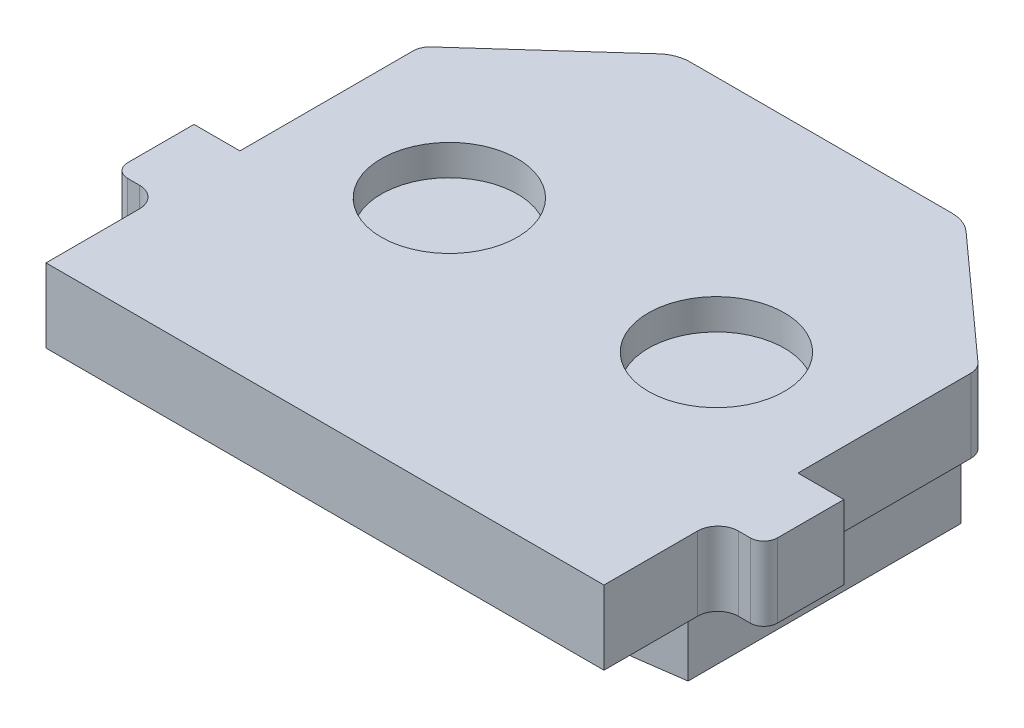
ISO-10303-21;
HEADER;
FILE_DESCRIPTION(('STEP AP214'),'2;1');
FILE_NAME('part.step','',(''),(''),'','','');
FILE_SCHEMA(('AUTOMOTIVE_DESIGN { 1 0 10303 214 1 1 1 1 }'));
ENDSEC;
DATA;
#1=APPLICATION_CONTEXT('core data for automotive mechanical design processes');
#2=APPLICATION_PROTOCOL_DEFINITION('international standard','automotive_design',2000,#1);
#3=PRODUCT_CONTEXT('',#1,'mechanical');
#4=PRODUCT('Part','Part','',(#3));
#5=PRODUCT_RELATED_PRODUCT_CATEGORY('part','',(#4));
#6=PRODUCT_DEFINITION_FORMATION('','',#4);
#7=PRODUCT_DEFINITION_CONTEXT('part definition',#1,'design');
#8=PRODUCT_DEFINITION('design','',#6,#7);
#9=PRODUCT_DEFINITION_SHAPE('','',#8);
#10=(LENGTH_UNIT() NAMED_UNIT(*) SI_UNIT(.MILLI.,.METRE.));
#11=(NAMED_UNIT(*) PLANE_ANGLE_UNIT() SI_UNIT($,.RADIAN.));
#12=(NAMED_UNIT(*) SI_UNIT($,.STERADIAN.) SOLID_ANGLE_UNIT());
#13=UNCERTAINTY_MEASURE_WITH_UNIT(LENGTH_MEASURE(1.E-05),#10,'distance_accuracy_value','');
#14=(GEOMETRIC_REPRESENTATION_CONTEXT(3) GLOBAL_UNCERTAINTY_ASSIGNED_CONTEXT((#13)) GLOBAL_UNIT_ASSIGNED_CONTEXT((#10,
#11,#12)) REPRESENTATION_CONTEXT('',''));
#15=CARTESIAN_POINT('',(0.,0.,0.));
#16=DIRECTION('',(0.,0.,1.));
#17=DIRECTION('',(1.,0.,0.));
#18=AXIS2_PLACEMENT_3D('',#15,#16,#17);
#19=CARTESIAN_POINT('',(0.,0.,0.));
#20=DIRECTION('',(0.,1.,0.));
#21=DIRECTION('',(0.,0.,1.));
#22=AXIS2_PLACEMENT_3D('',#19,#20,#21);
#23=PLANE('',#22);
#24=CARTESIAN_POINT('',(19.558,0.,-8.88332391035825));
#25=DIRECTION('',(0.,1.,0.));
#26=DIRECTION('',(0.,0.,1.));
#27=AXIS2_PLACEMENT_3D('',#24,#25,#26);
#28=CIRCLE('',#27,1.27);
#29=CARTESIAN_POINT('',(20.4076311340183,0.,-9.82726614169802));
#30=VERTEX_POINT('',#29);
#31=CARTESIAN_POINT('',(20.828,0.,-8.88332391035824));
#32=VERTEX_POINT('',#31);
#33=EDGE_CURVE('E264',#30,#32,#28,.F.);
#34=ORIENTED_EDGE('',*,*,#33,.T.);
#35=DIRECTION('',(0.,0.,1.));
#36=VECTOR('',#35,1.);
#37=CARTESIAN_POINT('',(20.828,0.,0.));
#38=LINE('',#37,#36);
#39=CARTESIAN_POINT('',(20.828,0.,4.0386));
#40=VERTEX_POINT('',#39);
#41=EDGE_CURVE('E277',#32,#40,#38,.T.);
#42=ORIENTED_EDGE('',*,*,#41,.T.);
#43=DIRECTION('',(-1.,0.,0.));
#44=VECTOR('',#43,1.);
#45=CARTESIAN_POINT('',(0.,0.,4.0386));
#46=LINE('',#45,#44);
#47=CARTESIAN_POINT('',(24.257,0.,4.0386));
#48=VERTEX_POINT('',#47);
#49=EDGE_CURVE('E425',#48,#40,#46,.T.);
#50=ORIENTED_EDGE('',*,*,#49,.F.);
#51=DIRECTION('',(0.,0.,-1.));
#52=VECTOR('',#51,1.);
#53=CARTESIAN_POINT('',(24.257,0.,0.));
#54=LINE('',#53,#52);
#55=CARTESIAN_POINT('',(24.257,0.,8.99159999999999));
#56=VERTEX_POINT('',#55);
#57=EDGE_CURVE('E422',#56,#48,#54,.T.);
#58=ORIENTED_EDGE('',*,*,#57,.F.);
#59=CARTESIAN_POINT('',(23.241,0.,8.9916));
#60=DIRECTION('',(0.,1.,0.));
#61=DIRECTION('',(0.,0.,1.));
#62=AXIS2_PLACEMENT_3D('',#59,#60,#61);
#63=CIRCLE('',#62,1.016);
#64=CARTESIAN_POINT('',(23.241,0.,10.0076));
#65=VERTEX_POINT('',#64);
#66=EDGE_CURVE('E419',#65,#56,#63,.T.);
#67=ORIENTED_EDGE('',*,*,#66,.F.);
#68=DIRECTION('',(-1.,0.,0.));
#69=VECTOR('',#68,1.);
#70=CARTESIAN_POINT('',(0.,0.,10.0076));
#71=LINE('',#70,#69);
#72=CARTESIAN_POINT('',(22.352,0.,10.0076));
#73=VERTEX_POINT('',#72);
#74=EDGE_CURVE('E415',#65,#73,#71,.T.);
#75=ORIENTED_EDGE('',*,*,#74,.T.);
#76=CARTESIAN_POINT('',(22.352,0.,11.5316));
#77=DIRECTION('',(0.,1.,0.));
#78=DIRECTION('',(0.,0.,1.));
#79=AXIS2_PLACEMENT_3D('',#76,#77,#78);
#80=CIRCLE('',#79,1.524);
#81=CARTESIAN_POINT('',(20.828,0.,11.5316));
#82=VERTEX_POINT('',#81);
#83=EDGE_CURVE('E411',#73,#82,#80,.T.);
#84=ORIENTED_EDGE('',*,*,#83,.T.);
#85=DIRECTION('',(0.,0.,-1.));
#86=VECTOR('',#85,1.);
#87=CARTESIAN_POINT('',(20.828,0.,0.));
#88=LINE('',#87,#86);
#89=CARTESIAN_POINT('',(20.828,0.,18.5166));
#90=VERTEX_POINT('',#89);
#91=EDGE_CURVE('E407',#90,#82,#88,.T.);
#92=ORIENTED_EDGE('',*,*,#91,.F.);
#93=DIRECTION('',(1.,0.,0.));
#94=VECTOR('',#93,1.);
#95=CARTESIAN_POINT('',(0.,0.,18.5166));
#96=LINE('',#95,#94);
#97=CARTESIAN_POINT('',(-20.828,0.,18.5166));
#98=VERTEX_POINT('',#97);
#99=EDGE_CURVE('E404',#98,#90,#96,.T.);
#100=ORIENTED_EDGE('',*,*,#99,.F.);
#101=DIRECTION('',(0.,0.,-1.));
#102=VECTOR('',#101,1.);
#103=CARTESIAN_POINT('',(-20.828,0.,0.));
#104=LINE('',#103,#102);
#105=CARTESIAN_POINT('',(-20.828,0.,11.5316));
#106=VERTEX_POINT('',#105);
#107=EDGE_CURVE('E400',#98,#106,#104,.T.);
#108=ORIENTED_EDGE('',*,*,#107,.T.);
#109=CARTESIAN_POINT('',(-22.352,0.,11.5316));
#110=DIRECTION('',(0.,1.,0.));
#111=DIRECTION('',(0.,0.,1.));
#112=AXIS2_PLACEMENT_3D('',#109,#110,#111);
#113=CIRCLE('',#112,1.524);
#114=CARTESIAN_POINT('',(-22.352,0.,10.0076));
#115=VERTEX_POINT('',#114);
#116=EDGE_CURVE('E396',#115,#106,#113,.F.);
#117=ORIENTED_EDGE('',*,*,#116,.F.);
#118=DIRECTION('',(1.,0.,0.));
#119=VECTOR('',#118,1.);
#120=CARTESIAN_POINT('',(0.,0.,10.0076));
#121=LINE('',#120,#119);
#122=CARTESIAN_POINT('',(-23.241,0.,10.0076));
#123=VERTEX_POINT('',#122);
#124=EDGE_CURVE('E393',#123,#115,#121,.T.);
#125=ORIENTED_EDGE('',*,*,#124,.F.);
#126=CARTESIAN_POINT('',(-23.241,0.,8.9916));
#127=DIRECTION('',(0.,1.,0.));
#128=DIRECTION('',(0.,0.,1.));
#129=AXIS2_PLACEMENT_3D('',#126,#127,#128);
#130=CIRCLE('',#129,1.016);
#131=CARTESIAN_POINT('',(-24.257,0.,8.99159999999999));
#132=VERTEX_POINT('',#131);
#133=EDGE_CURVE('E389',#123,#132,#130,.F.);
#134=ORIENTED_EDGE('',*,*,#133,.T.);
#135=DIRECTION('',(0.,0.,-1.));
#136=VECTOR('',#135,1.);
#137=CARTESIAN_POINT('',(-24.257,0.,0.));
#138=LINE('',#137,#136);
#139=CARTESIAN_POINT('',(-24.257,0.,4.0386));
#140=VERTEX_POINT('',#139);
#141=EDGE_CURVE('E385',#132,#140,#138,.T.);
#142=ORIENTED_EDGE('',*,*,#141,.T.);
#143=DIRECTION('',(1.,0.,0.));
#144=VECTOR('',#143,1.);
#145=CARTESIAN_POINT('',(0.,0.,4.0386));
#146=LINE('',#145,#144);
#147=CARTESIAN_POINT('',(-20.828,0.,4.0386));
#148=VERTEX_POINT('',#147);
#149=EDGE_CURVE('E381',#140,#148,#146,.T.);
#150=ORIENTED_EDGE('',*,*,#149,.T.);
#151=DIRECTION('',(0.,0.,-1.));
#152=VECTOR('',#151,1.);
#153=CARTESIAN_POINT('',(-20.828,0.,0.));
#154=LINE('',#153,#152);
#155=CARTESIAN_POINT('',(-20.828,0.,-8.88332391035824));
#156=VERTEX_POINT('',#155);
#157=EDGE_CURVE('E377',#148,#156,#154,.T.);
#158=ORIENTED_EDGE('',*,*,#157,.T.);
#159=CARTESIAN_POINT('',(-19.558,0.,-8.88332391035825));
#160=DIRECTION('',(0.,1.,0.));
#161=DIRECTION('',(0.,0.,1.));
#162=AXIS2_PLACEMENT_3D('',#159,#160,#161);
#163=CIRCLE('',#162,1.27);
#164=CARTESIAN_POINT('',(-20.4076311340183,0.,-9.82726614169801));
#165=VERTEX_POINT('',#164);
#166=EDGE_CURVE('E373',#165,#156,#163,.T.);
#167=ORIENTED_EDGE('',*,*,#166,.F.);
#168=DIRECTION('',(-0.74326159948013,0.,0.669000892927833));
#169=VECTOR('',#168,1.);
#170=CARTESIAN_POINT('',(-14.0202202715154,0.,-15.5764984086418));
#171=LINE('',#170,#169);
#172=CARTESIAN_POINT('',(-11.4782622680367,0.,-17.8644844626795));
#173=VERTEX_POINT('',#172);
#174=EDGE_CURVE('E370',#173,#165,#171,.T.);
#175=ORIENTED_EDGE('',*,*,#174,.F.);
#176=CARTESIAN_POINT('',(-9.779,0.,-15.9766));
#177=DIRECTION('',(0.,1.,0.));
#178=DIRECTION('',(0.,0.,1.));
#179=AXIS2_PLACEMENT_3D('',#176,#177,#178);
#180=CIRCLE('',#179,2.54);
#181=CARTESIAN_POINT('',(-9.779,0.,-18.5166));
#182=VERTEX_POINT('',#181);
#183=EDGE_CURVE('E367',#182,#173,#180,.T.);
#184=ORIENTED_EDGE('',*,*,#183,.F.);
#185=DIRECTION('',(1.,0.,0.));
#186=VECTOR('',#185,1.);
#187=CARTESIAN_POINT('',(0.,0.,-18.5166));
#188=LINE('',#187,#186);
#189=CARTESIAN_POINT('',(9.779,0.,-18.5166));
#190=VERTEX_POINT('',#189);
#191=EDGE_CURVE('E363',#182,#190,#188,.T.);
#192=ORIENTED_EDGE('',*,*,#191,.T.);
#193=CARTESIAN_POINT('',(9.77899999999999,0.,-15.9766));
#194=DIRECTION('',(0.,1.,0.));
#195=DIRECTION('',(0.,0.,1.));
#196=AXIS2_PLACEMENT_3D('',#193,#194,#195);
#197=CIRCLE('',#196,2.54);
#198=CARTESIAN_POINT('',(11.4782622680367,0.,-17.8644844626795));
#199=VERTEX_POINT('',#198);
#200=EDGE_CURVE('E359',#190,#199,#197,.F.);
#201=ORIENTED_EDGE('',*,*,#200,.T.);
#202=DIRECTION('',(0.74326159948013,0.,0.669000892927833));
#203=VECTOR('',#202,1.);
#204=CARTESIAN_POINT('',(14.0202202715154,0.,-15.5764984086418));
#205=LINE('',#204,#203);
#206=EDGE_CURVE('E355',#199,#30,#205,.T.);
#207=ORIENTED_EDGE('',*,*,#206,.T.);
#208=EDGE_LOOP('',(#34,#42,#50,#58,#67,#75,#84,#92,#100,#108,#117,#125,#134,#142,#150,#158,#167,
#175,#184,#192,#201,#207));
#209=FACE_BOUND('',#208,.T.);
#210=DIRECTION('',(0.74326159948013,0.,0.669000892927833));
#211=VECTOR('',#210,1.);
#212=CARTESIAN_POINT('',(10.795,0.,-17.2466));
#213=LINE('',#212,#211);
#214=CARTESIAN_POINT('',(10.795,0.,-17.2466));
#215=VERTEX_POINT('',#214);
#216=CARTESIAN_POINT('',(20.0456338671297,0.,-8.92021488662018));
#217=VERTEX_POINT('',#216);
#218=EDGE_CURVE('E57',#215,#217,#213,.T.);
#219=ORIENTED_EDGE('',*,*,#218,.F.);
#220=DIRECTION('',(1.,0.,0.));
#221=VECTOR('',#220,1.);
#222=CARTESIAN_POINT('',(10.795,0.,-17.2466));
#223=LINE('',#222,#221);
#224=CARTESIAN_POINT('',(-10.795,0.,-17.2466));
#225=VERTEX_POINT('',#224);
#226=EDGE_CURVE('E61',#225,#215,#223,.T.);
#227=ORIENTED_EDGE('',*,*,#226,.F.);
#228=DIRECTION('',(0.74326159948013,0.,-0.669000892927833));
#229=VECTOR('',#228,1.);
#230=CARTESIAN_POINT('',(-10.795,0.,-17.2466));
#231=LINE('',#230,#229);
#232=CARTESIAN_POINT('',(-20.0456338671297,0.,-8.92021488662019));
#233=VERTEX_POINT('',#232);
#234=EDGE_CURVE('E900',#233,#225,#231,.T.);
#235=ORIENTED_EDGE('',*,*,#234,.F.);
#236=DIRECTION('',(0.,0.,-1.));
#237=VECTOR('',#236,1.);
#238=CARTESIAN_POINT('',(-20.0456338671297,0.,-8.92021488662019));
#239=LINE('',#238,#237);
#240=CARTESIAN_POINT('',(-20.0456338671297,0.,11.4554));
#241=VERTEX_POINT('',#240);
#242=EDGE_CURVE('E920',#241,#233,#239,.T.);
#243=ORIENTED_EDGE('',*,*,#242,.F.);
#244=CARTESIAN_POINT('',(0.,0.,-120.636240079397));
#245=DIRECTION('',(0.,-1.,0.));
#246=DIRECTION('',(0.,0.,-1.));
#247=AXIS2_PLACEMENT_3D('',#244,#245,#246);
#248=CIRCLE('',#247,133.604);
#249=CARTESIAN_POINT('',(20.0456338671297,0.,11.4554));
#250=VERTEX_POINT('',#249);
#251=EDGE_CURVE('E923',#250,#241,#248,.T.);
#252=ORIENTED_EDGE('',*,*,#251,.F.);
#253=DIRECTION('',(0.,0.,1.));
#254=VECTOR('',#253,1.);
#255=CARTESIAN_POINT('',(20.0456338671297,0.,-8.92021488662018));
#256=LINE('',#255,#254);
#257=EDGE_CURVE('E925',#217,#250,#256,.T.);
#258=ORIENTED_EDGE('',*,*,#257,.F.);
#259=EDGE_LOOP('',(#219,#227,#235,#243,#252,#258));
#260=FACE_BOUND('',#259,.T.);
#261=ADVANCED_FACE('F41',(#209,#260),#23,.F.);
#262=CARTESIAN_POINT('',(19.558,5.5118,-8.88332391035825));
#263=DIRECTION('',(0.,-1.,0.));
#264=DIRECTION('',(0.,0.,-1.));
#265=AXIS2_PLACEMENT_3D('',#262,#263,#264);
#266=CYLINDRICAL_SURFACE('',#265,1.27);
#267=ORIENTED_EDGE('',*,*,#33,.F.);
#268=DIRECTION('',(0.,-1.,0.));
#269=VECTOR('',#268,1.);
#270=CARTESIAN_POINT('',(20.4076311340183,5.5118,-9.82726614169802));
#271=LINE('',#270,#269);
#272=CARTESIAN_POINT('',(20.4076311340183,5.5118,-9.82726614169802));
#273=VERTEX_POINT('',#272);
#274=EDGE_CURVE('E11',#273,#30,#271,.T.);
#275=ORIENTED_EDGE('',*,*,#274,.F.);
#276=CARTESIAN_POINT('',(19.558,5.5118,-8.88332391035825));
#277=DIRECTION('',(0.,1.,0.));
#278=DIRECTION('',(0.,0.,1.));
#279=AXIS2_PLACEMENT_3D('',#276,#277,#278);
#280=CIRCLE('',#279,1.27);
#281=CARTESIAN_POINT('',(20.828,5.5118,-8.88332391035824));
#282=VERTEX_POINT('',#281);
#283=EDGE_CURVE('E272',#273,#282,#280,.F.);
#284=ORIENTED_EDGE('',*,*,#283,.T.);
#285=DIRECTION('',(0.,-1.,0.));
#286=VECTOR('',#285,1.);
#287=CARTESIAN_POINT('',(20.828,5.5118,-8.88332391035824));
#288=LINE('',#287,#286);
#289=EDGE_CURVE('E351',#282,#32,#288,.T.);
#290=ORIENTED_EDGE('',*,*,#289,.T.);
#291=EDGE_LOOP('',(#267,#275,#284,#290));
#292=FACE_BOUND('',#291,.T.);
#293=ADVANCED_FACE('F43',(#292),#266,.T.);
#294=CARTESIAN_POINT('',(14.0202202715154,5.5118,-15.5764984086418));
#295=DIRECTION('',(0.669000892927833,0.,-0.74326159948013));
#296=DIRECTION('',(-0.74326159948013,0.,-0.669000892927833));
#297=AXIS2_PLACEMENT_3D('',#294,#295,#296);
#298=PLANE('',#297);
#299=ORIENTED_EDGE('',*,*,#206,.F.);
#300=DIRECTION('',(0.,-1.,0.));
#301=VECTOR('',#300,1.);
#302=CARTESIAN_POINT('',(11.4782622680367,5.5118,-17.8644844626795));
#303=LINE('',#302,#301);
#304=CARTESIAN_POINT('',(11.4782622680367,5.5118,-17.8644844626795));
#305=VERTEX_POINT('',#304);
#306=EDGE_CURVE('E50',#305,#199,#303,.T.);
#307=ORIENTED_EDGE('',*,*,#306,.F.);
#308=DIRECTION('',(0.74326159948013,0.,0.669000892927833));
#309=VECTOR('',#308,1.);
#310=CARTESIAN_POINT('',(14.0202202715154,5.5118,-15.5764984086418));
#311=LINE('',#310,#309);
#312=EDGE_CURVE('E276',#305,#273,#311,.T.);
#313=ORIENTED_EDGE('',*,*,#312,.T.);
#314=ORIENTED_EDGE('',*,*,#274,.T.);
#315=EDGE_LOOP('',(#299,#307,#313,#314));
#316=FACE_BOUND('',#315,.T.);
#317=ADVANCED_FACE('F504',(#316),#298,.T.);
#318=CARTESIAN_POINT('',(9.77899999999999,5.5118,-15.9766));
#319=DIRECTION('',(0.,-1.,0.));
#320=DIRECTION('',(0.,0.,-1.));
#321=AXIS2_PLACEMENT_3D('',#318,#319,#320);
#322=CYLINDRICAL_SURFACE('',#321,2.54);
#323=ORIENTED_EDGE('',*,*,#200,.F.);
#324=DIRECTION('',(0.,-1.,0.));
#325=VECTOR('',#324,1.);
#326=CARTESIAN_POINT('',(9.779,5.5118,-18.5166));
#327=LINE('',#326,#325);
#328=CARTESIAN_POINT('',(9.779,5.5118,-18.5166));
#329=VERTEX_POINT('',#328);
#330=EDGE_CURVE('E494',#329,#190,#327,.T.);
#331=ORIENTED_EDGE('',*,*,#330,.F.);
#332=CARTESIAN_POINT('',(9.77899999999999,5.5118,-15.9766));
#333=DIRECTION('',(0.,1.,0.));
#334=DIRECTION('',(0.,0.,1.));
#335=AXIS2_PLACEMENT_3D('',#332,#333,#334);
#336=CIRCLE('',#335,2.54);
#337=EDGE_CURVE('E281',#329,#305,#336,.F.);
#338=ORIENTED_EDGE('',*,*,#337,.T.);
#339=ORIENTED_EDGE('',*,*,#306,.T.);
#340=EDGE_LOOP('',(#323,#331,#338,#339));
#341=FACE_BOUND('',#340,.T.);
#342=ADVANCED_FACE('F500',(#341),#322,.T.);
#343=CARTESIAN_POINT('',(0.,5.5118,-18.5166));
#344=DIRECTION('',(0.,0.,-1.));
#345=DIRECTION('',(-1.,0.,0.));
#346=AXIS2_PLACEMENT_3D('',#343,#344,#345);
#347=PLANE('',#346);
#348=ORIENTED_EDGE('',*,*,#191,.F.);
#349=DIRECTION('',(0.,-1.,0.));
#350=VECTOR('',#349,1.);
#351=CARTESIAN_POINT('',(-9.779,5.5118,-18.5166));
#352=LINE('',#351,#350);
#353=CARTESIAN_POINT('',(-9.779,5.5118,-18.5166));
#354=VERTEX_POINT('',#353);
#355=EDGE_CURVE('E491',#354,#182,#352,.T.);
#356=ORIENTED_EDGE('',*,*,#355,.F.);
#357=DIRECTION('',(1.,0.,0.));
#358=VECTOR('',#357,1.);
#359=CARTESIAN_POINT('',(0.,5.5118,-18.5166));
#360=LINE('',#359,#358);
#361=EDGE_CURVE('E285',#354,#329,#360,.T.);
#362=ORIENTED_EDGE('',*,*,#361,.T.);
#363=ORIENTED_EDGE('',*,*,#330,.T.);
#364=EDGE_LOOP('',(#348,#356,#362,#363));
#365=FACE_BOUND('',#364,.T.);
#366=ADVANCED_FACE('F511',(#365),#347,.T.);
#367=CARTESIAN_POINT('',(-9.779,5.5118,-15.9766));
#368=DIRECTION('',(0.,-1.,0.));
#369=DIRECTION('',(0.,0.,-1.));
#370=AXIS2_PLACEMENT_3D('',#367,#368,#369);
#371=CYLINDRICAL_SURFACE('',#370,2.54);
#372=ORIENTED_EDGE('',*,*,#183,.T.);
#373=DIRECTION('',(0.,-1.,0.));
#374=VECTOR('',#373,1.);
#375=CARTESIAN_POINT('',(-11.4782622680367,5.5118,-17.8644844626795));
#376=LINE('',#375,#374);
#377=CARTESIAN_POINT('',(-11.4782622680367,5.5118,-17.8644844626795));
#378=VERTEX_POINT('',#377);
#379=EDGE_CURVE('E487',#378,#173,#376,.T.);
#380=ORIENTED_EDGE('',*,*,#379,.F.);
#381=CARTESIAN_POINT('',(-9.779,5.5118,-15.9766));
#382=DIRECTION('',(0.,1.,0.));
#383=DIRECTION('',(0.,0.,1.));
#384=AXIS2_PLACEMENT_3D('',#381,#382,#383);
#385=CIRCLE('',#384,2.54);
#386=EDGE_CURVE('E289',#354,#378,#385,.T.);
#387=ORIENTED_EDGE('',*,*,#386,.F.);
#388=ORIENTED_EDGE('',*,*,#355,.T.);
#389=EDGE_LOOP('',(#372,#380,#387,#388));
#390=FACE_BOUND('',#389,.T.);
#391=ADVANCED_FACE('F595',(#390),#371,.T.);
#392=CARTESIAN_POINT('',(-14.0202202715154,5.5118,-15.5764984086418));
#393=DIRECTION('',(0.669000892927833,0.,0.74326159948013));
#394=DIRECTION('',(0.74326159948013,0.,-0.669000892927833));
#395=AXIS2_PLACEMENT_3D('',#392,#393,#394);
#396=PLANE('',#395);
#397=ORIENTED_EDGE('',*,*,#174,.T.);
#398=DIRECTION('',(0.,-1.,0.));
#399=VECTOR('',#398,1.);
#400=CARTESIAN_POINT('',(-20.4076311340183,5.5118,-9.82726614169801));
#401=LINE('',#400,#399);
#402=CARTESIAN_POINT('',(-20.4076311340183,5.5118,-9.82726614169801));
#403=VERTEX_POINT('',#402);
#404=EDGE_CURVE('E483',#403,#165,#401,.T.);
#405=ORIENTED_EDGE('',*,*,#404,.F.);
#406=DIRECTION('',(-0.74326159948013,0.,0.669000892927833));
#407=VECTOR('',#406,1.);
#408=CARTESIAN_POINT('',(-14.0202202715154,5.5118,-15.5764984086418));
#409=LINE('',#408,#407);
#410=EDGE_CURVE('E292',#378,#403,#409,.T.);
#411=ORIENTED_EDGE('',*,*,#410,.F.);
#412=ORIENTED_EDGE('',*,*,#379,.T.);
#413=EDGE_LOOP('',(#397,#405,#411,#412));
#414=FACE_BOUND('',#413,.T.);
#415=ADVANCED_FACE('F591',(#414),#396,.F.);
#416=CARTESIAN_POINT('',(-19.558,5.5118,-8.88332391035825));
#417=DIRECTION('',(0.,-1.,0.));
#418=DIRECTION('',(0.,0.,-1.));
#419=AXIS2_PLACEMENT_3D('',#416,#417,#418);
#420=CYLINDRICAL_SURFACE('',#419,1.27);
#421=ORIENTED_EDGE('',*,*,#166,.T.);
#422=DIRECTION('',(0.,-1.,0.));
#423=VECTOR('',#422,1.);
#424=CARTESIAN_POINT('',(-20.828,5.5118,-8.88332391035824));
#425=LINE('',#424,#423);
#426=CARTESIAN_POINT('',(-20.828,5.5118,-8.88332391035824));
#427=VERTEX_POINT('',#426);
#428=EDGE_CURVE('E480',#427,#156,#425,.T.);
#429=ORIENTED_EDGE('',*,*,#428,.F.);
#430=CARTESIAN_POINT('',(-19.558,5.5118,-8.88332391035825));
#431=DIRECTION('',(0.,1.,0.));
#432=DIRECTION('',(0.,0.,1.));
#433=AXIS2_PLACEMENT_3D('',#430,#431,#432);
#434=CIRCLE('',#433,1.27);
#435=EDGE_CURVE('E295',#403,#427,#434,.T.);
#436=ORIENTED_EDGE('',*,*,#435,.F.);
#437=ORIENTED_EDGE('',*,*,#404,.T.);
#438=EDGE_LOOP('',(#421,#429,#436,#437));
#439=FACE_BOUND('',#438,.T.);
#440=ADVANCED_FACE('F588',(#439),#420,.T.);
#441=CARTESIAN_POINT('',(-20.828,5.5118,0.));
#442=DIRECTION('',(-1.,0.,0.));
#443=DIRECTION('',(0.,0.,1.));
#444=AXIS2_PLACEMENT_3D('',#441,#442,#443);
#445=PLANE('',#444);
#446=ORIENTED_EDGE('',*,*,#157,.F.);
#447=DIRECTION('',(0.,-1.,0.));
#448=VECTOR('',#447,1.);
#449=CARTESIAN_POINT('',(-20.828,5.5118,4.0386));
#450=LINE('',#449,#448);
#451=CARTESIAN_POINT('',(-20.828,5.5118,4.0386));
#452=VERTEX_POINT('',#451);
#453=EDGE_CURVE('E477',#452,#148,#450,.T.);
#454=ORIENTED_EDGE('',*,*,#453,.F.);
#455=DIRECTION('',(0.,0.,-1.));
#456=VECTOR('',#455,1.);
#457=CARTESIAN_POINT('',(-20.828,5.5118,0.));
#458=LINE('',#457,#456);
#459=EDGE_CURVE('E298',#452,#427,#458,.T.);
#460=ORIENTED_EDGE('',*,*,#459,.T.);
#461=ORIENTED_EDGE('',*,*,#428,.T.);
#462=EDGE_LOOP('',(#446,#454,#460,#461));
#463=FACE_BOUND('',#462,.T.);
#464=ADVANCED_FACE('F584',(#463),#445,.T.);
#465=CARTESIAN_POINT('',(0.,5.5118,4.0386));
#466=DIRECTION('',(0.,0.,-1.));
#467=DIRECTION('',(-1.,0.,0.));
#468=AXIS2_PLACEMENT_3D('',#465,#466,#467);
#469=PLANE('',#468);
#470=ORIENTED_EDGE('',*,*,#149,.F.);
#471=DIRECTION('',(0.,-1.,0.));
#472=VECTOR('',#471,1.);
#473=CARTESIAN_POINT('',(-24.257,5.5118,4.0386));
#474=LINE('',#473,#472);
#475=CARTESIAN_POINT('',(-24.257,5.5118,4.0386));
#476=VERTEX_POINT('',#475);
#477=EDGE_CURVE('E474',#476,#140,#474,.T.);
#478=ORIENTED_EDGE('',*,*,#477,.F.);
#479=DIRECTION('',(1.,0.,0.));
#480=VECTOR('',#479,1.);
#481=CARTESIAN_POINT('',(0.,5.5118,4.0386));
#482=LINE('',#481,#480);
#483=EDGE_CURVE('E302',#476,#452,#482,.T.);
#484=ORIENTED_EDGE('',*,*,#483,.T.);
#485=ORIENTED_EDGE('',*,*,#453,.T.);
#486=EDGE_LOOP('',(#470,#478,#484,#485));
#487=FACE_BOUND('',#486,.T.);
#488=ADVANCED_FACE('F580',(#487),#469,.T.);
#489=CARTESIAN_POINT('',(-24.257,5.5118,0.));
#490=DIRECTION('',(-1.,0.,0.));
#491=DIRECTION('',(0.,0.,1.));
#492=AXIS2_PLACEMENT_3D('',#489,#490,#491);
#493=PLANE('',#492);
#494=ORIENTED_EDGE('',*,*,#141,.F.);
#495=DIRECTION('',(0.,-1.,0.));
#496=VECTOR('',#495,1.);
#497=CARTESIAN_POINT('',(-24.257,5.5118,8.99159999999999));
#498=LINE('',#497,#496);
#499=CARTESIAN_POINT('',(-24.257,5.5118,8.99159999999999));
#500=VERTEX_POINT('',#499);
#501=EDGE_CURVE('E471',#500,#132,#498,.T.);
#502=ORIENTED_EDGE('',*,*,#501,.F.);
#503=DIRECTION('',(0.,0.,-1.));
#504=VECTOR('',#503,1.);
#505=CARTESIAN_POINT('',(-24.257,5.5118,0.));
#506=LINE('',#505,#504);
#507=EDGE_CURVE('E306',#500,#476,#506,.T.);
#508=ORIENTED_EDGE('',*,*,#507,.T.);
#509=ORIENTED_EDGE('',*,*,#477,.T.);
#510=EDGE_LOOP('',(#494,#502,#508,#509));
#511=FACE_BOUND('',#510,.T.);
#512=ADVANCED_FACE('F575',(#511),#493,.T.);
#513=CARTESIAN_POINT('',(-23.241,5.5118,8.9916));
#514=DIRECTION('',(0.,-1.,0.));
#515=DIRECTION('',(0.,0.,-1.));
#516=AXIS2_PLACEMENT_3D('',#513,#514,#515);
#517=CYLINDRICAL_SURFACE('',#516,1.016);
#518=ORIENTED_EDGE('',*,*,#133,.F.);
#519=DIRECTION('',(0.,-1.,0.));
#520=VECTOR('',#519,1.);
#521=CARTESIAN_POINT('',(-23.241,5.5118,10.0076));
#522=LINE('',#521,#520);
#523=CARTESIAN_POINT('',(-23.241,5.5118,10.0076));
#524=VERTEX_POINT('',#523);
#525=EDGE_CURVE('E468',#524,#123,#522,.T.);
#526=ORIENTED_EDGE('',*,*,#525,.F.);
#527=CARTESIAN_POINT('',(-23.241,5.5118,8.9916));
#528=DIRECTION('',(0.,1.,0.));
#529=DIRECTION('',(0.,0.,1.));
#530=AXIS2_PLACEMENT_3D('',#527,#528,#529);
#531=CIRCLE('',#530,1.016);
#532=EDGE_CURVE('E310',#524,#500,#531,.F.);
#533=ORIENTED_EDGE('',*,*,#532,.T.);
#534=ORIENTED_EDGE('',*,*,#501,.T.);
#535=EDGE_LOOP('',(#518,#526,#533,#534));
#536=FACE_BOUND('',#535,.T.);
#537=ADVANCED_FACE('F569',(#536),#517,.T.);
#538=CARTESIAN_POINT('',(0.,5.5118,10.0076));
#539=DIRECTION('',(0.,0.,-1.));
#540=DIRECTION('',(-1.,0.,0.));
#541=AXIS2_PLACEMENT_3D('',#538,#539,#540);
#542=PLANE('',#541);
#543=ORIENTED_EDGE('',*,*,#124,.T.);
#544=DIRECTION('',(0.,-1.,0.));
#545=VECTOR('',#544,1.);
#546=CARTESIAN_POINT('',(-22.352,5.5118,10.0076));
#547=LINE('',#546,#545);
#548=CARTESIAN_POINT('',(-22.352,5.5118,10.0076));
#549=VERTEX_POINT('',#548);
#550=EDGE_CURVE('E464',#549,#115,#547,.T.);
#551=ORIENTED_EDGE('',*,*,#550,.F.);
#552=DIRECTION('',(1.,0.,0.));
#553=VECTOR('',#552,1.);
#554=CARTESIAN_POINT('',(0.,5.5118,10.0076));
#555=LINE('',#554,#553);
#556=EDGE_CURVE('E314',#524,#549,#555,.T.);
#557=ORIENTED_EDGE('',*,*,#556,.F.);
#558=ORIENTED_EDGE('',*,*,#525,.T.);
#559=EDGE_LOOP('',(#543,#551,#557,#558));
#560=FACE_BOUND('',#559,.T.);
#561=ADVANCED_FACE('F596',(#560),#542,.F.);
#562=CARTESIAN_POINT('',(-22.352,5.5118,11.5316));
#563=DIRECTION('',(0.,-1.,0.));
#564=DIRECTION('',(0.,0.,-1.));
#565=AXIS2_PLACEMENT_3D('',#562,#563,#564);
#566=CYLINDRICAL_SURFACE('',#565,1.524);
#567=ORIENTED_EDGE('',*,*,#116,.T.);
#568=DIRECTION('',(0.,-1.,0.));
#569=VECTOR('',#568,1.);
#570=CARTESIAN_POINT('',(-20.828,5.5118,11.5316));
#571=LINE('',#570,#569);
#572=CARTESIAN_POINT('',(-20.828,5.5118,11.5316));
#573=VERTEX_POINT('',#572);
#574=EDGE_CURVE('E461',#573,#106,#571,.T.);
#575=ORIENTED_EDGE('',*,*,#574,.F.);
#576=CARTESIAN_POINT('',(-22.352,5.5118,11.5316));
#577=DIRECTION('',(0.,1.,0.));
#578=DIRECTION('',(0.,0.,1.));
#579=AXIS2_PLACEMENT_3D('',#576,#577,#578);
#580=CIRCLE('',#579,1.524);
#581=EDGE_CURVE('E317',#549,#573,#580,.F.);
#582=ORIENTED_EDGE('',*,*,#581,.F.);
#583=ORIENTED_EDGE('',*,*,#550,.T.);
#584=EDGE_LOOP('',(#567,#575,#582,#583));
#585=FACE_BOUND('',#584,.T.);
#586=ADVANCED_FACE('F563',(#585),#566,.F.);
#587=CARTESIAN_POINT('',(-20.828,5.5118,0.));
#588=DIRECTION('',(-1.,0.,0.));
#589=DIRECTION('',(0.,0.,1.));
#590=AXIS2_PLACEMENT_3D('',#587,#588,#589);
#591=PLANE('',#590);
#592=ORIENTED_EDGE('',*,*,#107,.F.);
#593=DIRECTION('',(0.,-1.,0.));
#594=VECTOR('',#593,1.);
#595=CARTESIAN_POINT('',(-20.828,5.5118,18.5166));
#596=LINE('',#595,#594);
#597=CARTESIAN_POINT('',(-20.828,5.5118,18.5166));
#598=VERTEX_POINT('',#597);
#599=EDGE_CURVE('E458',#598,#98,#596,.T.);
#600=ORIENTED_EDGE('',*,*,#599,.F.);
#601=DIRECTION('',(0.,0.,-1.));
#602=VECTOR('',#601,1.);
#603=CARTESIAN_POINT('',(-20.828,5.5118,0.));
#604=LINE('',#603,#602);
#605=EDGE_CURVE('E320',#598,#573,#604,.T.);
#606=ORIENTED_EDGE('',*,*,#605,.T.);
#607=ORIENTED_EDGE('',*,*,#574,.T.);
#608=EDGE_LOOP('',(#592,#600,#606,#607));
#609=FACE_BOUND('',#608,.T.);
#610=ADVANCED_FACE('F559',(#609),#591,.T.);
#611=CARTESIAN_POINT('',(0.,5.5118,18.5166));
#612=DIRECTION('',(0.,0.,-1.));
#613=DIRECTION('',(-1.,0.,0.));
#614=AXIS2_PLACEMENT_3D('',#611,#612,#613);
#615=PLANE('',#614);
#616=ORIENTED_EDGE('',*,*,#99,.T.);
#617=DIRECTION('',(0.,-1.,0.));
#618=VECTOR('',#617,1.);
#619=CARTESIAN_POINT('',(20.828,5.5118,18.5166));
#620=LINE('',#619,#618);
#621=CARTESIAN_POINT('',(20.828,5.5118,18.5166));
#622=VERTEX_POINT('',#621);
#623=EDGE_CURVE('E454',#622,#90,#620,.T.);
#624=ORIENTED_EDGE('',*,*,#623,.F.);
#625=DIRECTION('',(1.,0.,0.));
#626=VECTOR('',#625,1.);
#627=CARTESIAN_POINT('',(0.,5.5118,18.5166));
#628=LINE('',#627,#626);
#629=EDGE_CURVE('E324',#598,#622,#628,.T.);
#630=ORIENTED_EDGE('',*,*,#629,.F.);
#631=ORIENTED_EDGE('',*,*,#599,.T.);
#632=EDGE_LOOP('',(#616,#624,#630,#631));
#633=FACE_BOUND('',#632,.T.);
#634=ADVANCED_FACE('F554',(#633),#615,.F.);
#635=CARTESIAN_POINT('',(20.828,5.5118,0.));
#636=DIRECTION('',(-1.,0.,0.));
#637=DIRECTION('',(0.,0.,1.));
#638=AXIS2_PLACEMENT_3D('',#635,#636,#637);
#639=PLANE('',#638);
#640=ORIENTED_EDGE('',*,*,#91,.T.);
#641=DIRECTION('',(0.,-1.,0.));
#642=VECTOR('',#641,1.);
#643=CARTESIAN_POINT('',(20.828,5.5118,11.5316));
#644=LINE('',#643,#642);
#645=CARTESIAN_POINT('',(20.828,5.5118,11.5316));
#646=VERTEX_POINT('',#645);
#647=EDGE_CURVE('E451',#646,#82,#644,.T.);
#648=ORIENTED_EDGE('',*,*,#647,.F.);
#649=DIRECTION('',(0.,0.,-1.));
#650=VECTOR('',#649,1.);
#651=CARTESIAN_POINT('',(20.828,5.5118,0.));
#652=LINE('',#651,#650);
#653=EDGE_CURVE('E327',#622,#646,#652,.T.);
#654=ORIENTED_EDGE('',*,*,#653,.F.);
#655=ORIENTED_EDGE('',*,*,#623,.T.);
#656=EDGE_LOOP('',(#640,#648,#654,#655));
#657=FACE_BOUND('',#656,.T.);
#658=ADVANCED_FACE('F550',(#657),#639,.F.);
#659=CARTESIAN_POINT('',(22.352,5.5118,11.5316));
#660=DIRECTION('',(0.,-1.,0.));
#661=DIRECTION('',(0.,0.,-1.));
#662=AXIS2_PLACEMENT_3D('',#659,#660,#661);
#663=CYLINDRICAL_SURFACE('',#662,1.524);
#664=ORIENTED_EDGE('',*,*,#83,.F.);
#665=DIRECTION('',(0.,-1.,0.));
#666=VECTOR('',#665,1.);
#667=CARTESIAN_POINT('',(22.352,5.5118,10.0076));
#668=LINE('',#667,#666);
#669=CARTESIAN_POINT('',(22.352,5.5118,10.0076));
#670=VERTEX_POINT('',#669);
#671=EDGE_CURVE('E448',#670,#73,#668,.T.);
#672=ORIENTED_EDGE('',*,*,#671,.F.);
#673=CARTESIAN_POINT('',(22.352,5.5118,11.5316));
#674=DIRECTION('',(0.,1.,0.));
#675=DIRECTION('',(0.,0.,1.));
#676=AXIS2_PLACEMENT_3D('',#673,#674,#675);
#677=CIRCLE('',#676,1.524);
#678=EDGE_CURVE('E330',#670,#646,#677,.T.);
#679=ORIENTED_EDGE('',*,*,#678,.T.);
#680=ORIENTED_EDGE('',*,*,#647,.T.);
#681=EDGE_LOOP('',(#664,#672,#679,#680));
#682=FACE_BOUND('',#681,.T.);
#683=ADVANCED_FACE('F545',(#682),#663,.F.);
#684=CARTESIAN_POINT('',(0.,5.5118,10.0076));
#685=DIRECTION('',(0.,0.,1.));
#686=DIRECTION('',(1.,0.,0.));
#687=AXIS2_PLACEMENT_3D('',#684,#685,#686);
#688=PLANE('',#687);
#689=ORIENTED_EDGE('',*,*,#74,.F.);
#690=DIRECTION('',(0.,-1.,0.));
#691=VECTOR('',#690,1.);
#692=CARTESIAN_POINT('',(23.241,5.5118,10.0076));
#693=LINE('',#692,#691);
#694=CARTESIAN_POINT('',(23.241,5.5118,10.0076));
#695=VERTEX_POINT('',#694);
#696=EDGE_CURVE('E445',#695,#65,#693,.T.);
#697=ORIENTED_EDGE('',*,*,#696,.F.);
#698=DIRECTION('',(-1.,0.,0.));
#699=VECTOR('',#698,1.);
#700=CARTESIAN_POINT('',(0.,5.5118,10.0076));
#701=LINE('',#700,#699);
#702=EDGE_CURVE('E334',#695,#670,#701,.T.);
#703=ORIENTED_EDGE('',*,*,#702,.T.);
#704=ORIENTED_EDGE('',*,*,#671,.T.);
#705=EDGE_LOOP('',(#689,#697,#703,#704));
#706=FACE_BOUND('',#705,.T.);
#707=ADVANCED_FACE('F540',(#706),#688,.T.);
#708=CARTESIAN_POINT('',(23.241,5.5118,8.9916));
#709=DIRECTION('',(0.,-1.,0.));
#710=DIRECTION('',(0.,0.,-1.));
#711=AXIS2_PLACEMENT_3D('',#708,#709,#710);
#712=CYLINDRICAL_SURFACE('',#711,1.016);
#713=ORIENTED_EDGE('',*,*,#66,.T.);
#714=DIRECTION('',(0.,-1.,0.));
#715=VECTOR('',#714,1.);
#716=CARTESIAN_POINT('',(24.257,5.5118,8.99159999999999));
#717=LINE('',#716,#715);
#718=CARTESIAN_POINT('',(24.257,5.5118,8.99159999999999));
#719=VERTEX_POINT('',#718);
#720=EDGE_CURVE('E441',#719,#56,#717,.T.);
#721=ORIENTED_EDGE('',*,*,#720,.F.);
#722=CARTESIAN_POINT('',(23.241,5.5118,8.9916));
#723=DIRECTION('',(0.,1.,0.));
#724=DIRECTION('',(0.,0.,1.));
#725=AXIS2_PLACEMENT_3D('',#722,#723,#724);
#726=CIRCLE('',#725,1.016);
#727=EDGE_CURVE('E338',#695,#719,#726,.T.);
#728=ORIENTED_EDGE('',*,*,#727,.F.);
#729=ORIENTED_EDGE('',*,*,#696,.T.);
#730=EDGE_LOOP('',(#713,#721,#728,#729));
#731=FACE_BOUND('',#730,.T.);
#732=ADVANCED_FACE('F537',(#731),#712,.T.);
#733=CARTESIAN_POINT('',(24.257,5.5118,0.));
#734=DIRECTION('',(-1.,0.,0.));
#735=DIRECTION('',(0.,0.,1.));
#736=AXIS2_PLACEMENT_3D('',#733,#734,#735);
#737=PLANE('',#736);
#738=ORIENTED_EDGE('',*,*,#57,.T.);
#739=DIRECTION('',(0.,-1.,0.));
#740=VECTOR('',#739,1.);
#741=CARTESIAN_POINT('',(24.257,5.5118,4.0386));
#742=LINE('',#741,#740);
#743=CARTESIAN_POINT('',(24.257,5.5118,4.0386));
#744=VERTEX_POINT('',#743);
#745=EDGE_CURVE('E437',#744,#48,#742,.T.);
#746=ORIENTED_EDGE('',*,*,#745,.F.);
#747=DIRECTION('',(0.,0.,-1.));
#748=VECTOR('',#747,1.);
#749=CARTESIAN_POINT('',(24.257,5.5118,0.));
#750=LINE('',#749,#748);
#751=EDGE_CURVE('E341',#719,#744,#750,.T.);
#752=ORIENTED_EDGE('',*,*,#751,.F.);
#753=ORIENTED_EDGE('',*,*,#720,.T.);
#754=EDGE_LOOP('',(#738,#746,#752,#753));
#755=FACE_BOUND('',#754,.T.);
#756=ADVANCED_FACE('F532',(#755),#737,.F.);
#757=CARTESIAN_POINT('',(0.,5.5118,4.0386));
#758=DIRECTION('',(0.,0.,1.));
#759=DIRECTION('',(1.,0.,0.));
#760=AXIS2_PLACEMENT_3D('',#757,#758,#759);
#761=PLANE('',#760);
#762=ORIENTED_EDGE('',*,*,#49,.T.);
#763=DIRECTION('',(0.,-1.,0.));
#764=VECTOR('',#763,1.);
#765=CARTESIAN_POINT('',(20.828,5.5118,4.0386));
#766=LINE('',#765,#764);
#767=CARTESIAN_POINT('',(20.828,5.5118,4.0386));
#768=VERTEX_POINT('',#767);
#769=EDGE_CURVE('E434',#768,#40,#766,.T.);
#770=ORIENTED_EDGE('',*,*,#769,.F.);
#771=DIRECTION('',(-1.,0.,0.));
#772=VECTOR('',#771,1.);
#773=CARTESIAN_POINT('',(0.,5.5118,4.0386));
#774=LINE('',#773,#772);
#775=EDGE_CURVE('E344',#744,#768,#774,.T.);
#776=ORIENTED_EDGE('',*,*,#775,.F.);
#777=ORIENTED_EDGE('',*,*,#745,.T.);
#778=EDGE_LOOP('',(#762,#770,#776,#777));
#779=FACE_BOUND('',#778,.T.);
#780=ADVANCED_FACE('F526',(#779),#761,.F.);
#781=CARTESIAN_POINT('',(20.828,5.5118,0.));
#782=DIRECTION('',(1.,0.,0.));
#783=DIRECTION('',(0.,0.,-1.));
#784=AXIS2_PLACEMENT_3D('',#781,#782,#783);
#785=PLANE('',#784);
#786=ORIENTED_EDGE('',*,*,#41,.F.);
#787=ORIENTED_EDGE('',*,*,#289,.F.);
#788=DIRECTION('',(0.,0.,1.));
#789=VECTOR('',#788,1.);
#790=CARTESIAN_POINT('',(20.828,5.5118,0.));
#791=LINE('',#790,#789);
#792=EDGE_CURVE('E347',#282,#768,#791,.T.);
#793=ORIENTED_EDGE('',*,*,#792,.T.);
#794=ORIENTED_EDGE('',*,*,#769,.T.);
#795=EDGE_LOOP('',(#786,#787,#793,#794));
#796=FACE_BOUND('',#795,.T.);
#797=ADVANCED_FACE('F522',(#796),#785,.T.);
#798=CARTESIAN_POINT('',(0.,5.5118,0.));
#799=DIRECTION('',(0.,1.,0.));
#800=DIRECTION('',(0.,0.,1.));
#801=AXIS2_PLACEMENT_3D('',#798,#799,#800);
#802=PLANE('',#801);
#803=CARTESIAN_POINT('',(-9.9695,5.5118,-0.736599999999993));
#804=DIRECTION('',(0.,1.,0.));
#805=DIRECTION('',(0.,0.,1.));
#806=AXIS2_PLACEMENT_3D('',#803,#804,#805);
#807=CIRCLE('',#806,5.08);
#808=CARTESIAN_POINT('',(-9.9695,5.5118,4.34340000000001));
#809=VERTEX_POINT('',#808);
#810=EDGE_CURVE('E265',#809,#809,#807,.T.);
#811=ORIENTED_EDGE('',*,*,#810,.F.);
#812=EDGE_LOOP('',(#811));
#813=FACE_BOUND('',#812,.T.);
#814=CARTESIAN_POINT('',(9.9695,5.5118,-0.736599999999993));
#815=DIRECTION('',(0.,1.,0.));
#816=DIRECTION('',(0.,0.,1.));
#817=AXIS2_PLACEMENT_3D('',#814,#815,#816);
#818=CIRCLE('',#817,5.08);
#819=CARTESIAN_POINT('',(9.9695,5.5118,4.34340000000001));
#820=VERTEX_POINT('',#819);
#821=EDGE_CURVE('E249',#820,#820,#818,.T.);
#822=ORIENTED_EDGE('',*,*,#821,.F.);
#823=EDGE_LOOP('',(#822));
#824=FACE_BOUND('',#823,.T.);
#825=ORIENTED_EDGE('',*,*,#283,.F.);
#826=ORIENTED_EDGE('',*,*,#312,.F.);
#827=ORIENTED_EDGE('',*,*,#337,.F.);
#828=ORIENTED_EDGE('',*,*,#361,.F.);
#829=ORIENTED_EDGE('',*,*,#386,.T.);
#830=ORIENTED_EDGE('',*,*,#410,.T.);
#831=ORIENTED_EDGE('',*,*,#435,.T.);
#832=ORIENTED_EDGE('',*,*,#459,.F.);
#833=ORIENTED_EDGE('',*,*,#483,.F.);
#834=ORIENTED_EDGE('',*,*,#507,.F.);
#835=ORIENTED_EDGE('',*,*,#532,.F.);
#836=ORIENTED_EDGE('',*,*,#556,.T.);
#837=ORIENTED_EDGE('',*,*,#581,.T.);
#838=ORIENTED_EDGE('',*,*,#605,.F.);
#839=ORIENTED_EDGE('',*,*,#629,.T.);
#840=ORIENTED_EDGE('',*,*,#653,.T.);
#841=ORIENTED_EDGE('',*,*,#678,.F.);
#842=ORIENTED_EDGE('',*,*,#702,.F.);
#843=ORIENTED_EDGE('',*,*,#727,.T.);
#844=ORIENTED_EDGE('',*,*,#751,.T.);
#845=ORIENTED_EDGE('',*,*,#775,.T.);
#846=ORIENTED_EDGE('',*,*,#792,.F.);
#847=EDGE_LOOP('',(#825,#826,#827,#828,#829,#830,#831,#832,#833,#834,#835,#836,#837,#838,#839,
#840,#841,#842,#843,#844,#845,#846));
#848=FACE_BOUND('',#847,.T.);
#849=ADVANCED_FACE('F516',(#813,#824,#848),#802,.T.);
#850=CARTESIAN_POINT('',(9.9695,3.2258,-0.736599999999993));
#851=DIRECTION('',(0.,1.,0.));
#852=DIRECTION('',(0.,0.,1.));
#853=AXIS2_PLACEMENT_3D('',#850,#851,#852);
#854=CYLINDRICAL_SURFACE('',#853,5.08);
#855=CARTESIAN_POINT('',(9.9695,3.2258,-0.736599999999993));
#856=DIRECTION('',(0.,1.,0.));
#857=DIRECTION('',(0.,0.,1.));
#858=AXIS2_PLACEMENT_3D('',#855,#856,#857);
#859=CIRCLE('',#858,5.08);
#860=CARTESIAN_POINT('',(9.9695,3.2258,4.34340000000001));
#861=VERTEX_POINT('',#860);
#862=EDGE_CURVE('E254',#861,#861,#859,.T.);
#863=ORIENTED_EDGE('',*,*,#862,.F.);
#864=EDGE_LOOP('',(#863));
#865=FACE_BOUND('',#864,.T.);
#866=ORIENTED_EDGE('',*,*,#821,.T.);
#867=EDGE_LOOP('',(#866));
#868=FACE_BOUND('',#867,.T.);
#869=ADVANCED_FACE('F672',(#865,#868),#854,.F.);
#870=CARTESIAN_POINT('',(9.9695,3.2258,-0.736599999999993));
#871=DIRECTION('',(0.,1.,0.));
#872=DIRECTION('',(0.,0.,1.));
#873=AXIS2_PLACEMENT_3D('',#870,#871,#872);
#874=PLANE('',#873);
#875=ORIENTED_EDGE('',*,*,#862,.T.);
#876=EDGE_LOOP('',(#875));
#877=FACE_BOUND('',#876,.T.);
#878=ADVANCED_FACE('F679',(#877),#874,.T.);
#879=CARTESIAN_POINT('',(-9.9695,3.2258,-0.736599999999993));
#880=DIRECTION('',(0.,1.,0.));
#881=DIRECTION('',(0.,0.,1.));
#882=AXIS2_PLACEMENT_3D('',#879,#880,#881);
#883=CYLINDRICAL_SURFACE('',#882,5.08);
#884=CARTESIAN_POINT('',(-9.9695,3.2258,-0.736599999999993));
#885=DIRECTION('',(0.,1.,0.));
#886=DIRECTION('',(0.,0.,1.));
#887=AXIS2_PLACEMENT_3D('',#884,#885,#886);
#888=CIRCLE('',#887,5.08);
#889=CARTESIAN_POINT('',(-9.9695,3.2258,4.34340000000001));
#890=VERTEX_POINT('',#889);
#891=EDGE_CURVE('E260',#890,#890,#888,.T.);
#892=ORIENTED_EDGE('',*,*,#891,.F.);
#893=EDGE_LOOP('',(#892));
#894=FACE_BOUND('',#893,.T.);
#895=ORIENTED_EDGE('',*,*,#810,.T.);
#896=EDGE_LOOP('',(#895));
#897=FACE_BOUND('',#896,.T.);
#898=ADVANCED_FACE('F686',(#894,#897),#883,.F.);
#899=CARTESIAN_POINT('',(-9.9695,3.2258,-0.736599999999993));
#900=DIRECTION('',(0.,1.,0.));
#901=DIRECTION('',(0.,0.,1.));
#902=AXIS2_PLACEMENT_3D('',#899,#900,#901);
#903=PLANE('',#902);
#904=ORIENTED_EDGE('',*,*,#891,.T.);
#905=EDGE_LOOP('',(#904));
#906=FACE_BOUND('',#905,.T.);
#907=ADVANCED_FACE('F694',(#906),#903,.T.);
#908=CARTESIAN_POINT('',(10.795,-4.6228,-17.2466));
#909=DIRECTION('',(-0.669000892927833,0.,0.74326159948013));
#910=DIRECTION('',(0.74326159948013,0.,0.669000892927833));
#911=AXIS2_PLACEMENT_3D('',#908,#909,#910);
#912=PLANE('',#911);
#913=ORIENTED_EDGE('',*,*,#218,.T.);
#914=DIRECTION('',(0.,1.,0.));
#915=VECTOR('',#914,1.);
#916=CARTESIAN_POINT('',(20.0456338671297,-4.6228,-8.92021488662018));
#917=LINE('',#916,#915);
#918=CARTESIAN_POINT('',(20.0456338671297,-4.6228,-8.92021488662018));
#919=VERTEX_POINT('',#918);
#920=EDGE_CURVE('E229',#919,#217,#917,.T.);
#921=ORIENTED_EDGE('',*,*,#920,.F.);
#922=DIRECTION('',(0.74326159948013,0.,0.669000892927833));
#923=VECTOR('',#922,1.);
#924=CARTESIAN_POINT('',(10.795,-4.6228,-17.2466));
#925=LINE('',#924,#923);
#926=CARTESIAN_POINT('',(10.795,-4.6228,-17.2466));
#927=VERTEX_POINT('',#926);
#928=EDGE_CURVE('E236',#927,#919,#925,.T.);
#929=ORIENTED_EDGE('',*,*,#928,.F.);
#930=DIRECTION('',(0.,1.,0.));
#931=VECTOR('',#930,1.);
#932=CARTESIAN_POINT('',(10.795,-4.6228,-17.2466));
#933=LINE('',#932,#931);
#934=EDGE_CURVE('E896',#927,#215,#933,.T.);
#935=ORIENTED_EDGE('',*,*,#934,.T.);
#936=EDGE_LOOP('',(#913,#921,#929,#935));
#937=FACE_BOUND('',#936,.T.);
#938=ADVANCED_FACE('F247',(#937),#912,.F.);
#939=CARTESIAN_POINT('',(20.0456338671297,-4.6228,-8.92021488662018));
#940=DIRECTION('',(-1.,0.,0.));
#941=DIRECTION('',(0.,0.,1.));
#942=AXIS2_PLACEMENT_3D('',#939,#940,#941);
#943=PLANE('',#942);
#944=ORIENTED_EDGE('',*,*,#257,.T.);
#945=DIRECTION('',(0.,1.,0.));
#946=VECTOR('',#945,1.);
#947=CARTESIAN_POINT('',(20.0456338671297,-4.6228,11.4554));
#948=LINE('',#947,#946);
#949=CARTESIAN_POINT('',(20.0456338671297,-4.6228,11.4554));
#950=VERTEX_POINT('',#949);
#951=EDGE_CURVE('E231',#950,#250,#948,.T.);
#952=ORIENTED_EDGE('',*,*,#951,.F.);
#953=DIRECTION('',(0.,0.,1.));
#954=VECTOR('',#953,1.);
#955=CARTESIAN_POINT('',(20.0456338671297,-4.6228,-8.92021488662018));
#956=LINE('',#955,#954);
#957=EDGE_CURVE('E224',#919,#950,#956,.T.);
#958=ORIENTED_EDGE('',*,*,#957,.F.);
#959=ORIENTED_EDGE('',*,*,#920,.T.);
#960=EDGE_LOOP('',(#944,#952,#958,#959));
#961=FACE_BOUND('',#960,.T.);
#962=ADVANCED_FACE('F227',(#961),#943,.F.);
#963=CARTESIAN_POINT('',(0.,-4.6228,-120.636240079397));
#964=DIRECTION('',(0.,1.,0.));
#965=DIRECTION('',(0.,0.,1.));
#966=AXIS2_PLACEMENT_3D('',#963,#964,#965);
#967=CYLINDRICAL_SURFACE('',#966,133.604);
#968=ORIENTED_EDGE('',*,*,#251,.T.);
#969=DIRECTION('',(0.,1.,0.));
#970=VECTOR('',#969,1.);
#971=CARTESIAN_POINT('',(-20.0456338671297,-4.6228,11.4554));
#972=LINE('',#971,#970);
#973=CARTESIAN_POINT('',(-20.0456338671297,-4.6228,11.4554));
#974=VERTEX_POINT('',#973);
#975=EDGE_CURVE('E256',#974,#241,#972,.T.);
#976=ORIENTED_EDGE('',*,*,#975,.F.);
#977=CARTESIAN_POINT('',(0.,-4.6228,-120.636240079397));
#978=DIRECTION('',(0.,-1.,0.));
#979=DIRECTION('',(0.,0.,-1.));
#980=AXIS2_PLACEMENT_3D('',#977,#978,#979);
#981=CIRCLE('',#980,133.604);
#982=EDGE_CURVE('E235',#950,#974,#981,.T.);
#983=ORIENTED_EDGE('',*,*,#982,.F.);
#984=ORIENTED_EDGE('',*,*,#951,.T.);
#985=EDGE_LOOP('',(#968,#976,#983,#984));
#986=FACE_BOUND('',#985,.T.);
#987=ADVANCED_FACE('F715',(#986),#967,.T.);
#988=CARTESIAN_POINT('',(-20.0456338671297,-4.6228,-8.92021488662019));
#989=DIRECTION('',(1.,0.,0.));
#990=DIRECTION('',(0.,0.,-1.));
#991=AXIS2_PLACEMENT_3D('',#988,#989,#990);
#992=PLANE('',#991);
#993=ORIENTED_EDGE('',*,*,#242,.T.);
#994=DIRECTION('',(0.,1.,0.));
#995=VECTOR('',#994,1.);
#996=CARTESIAN_POINT('',(-20.0456338671297,-4.6228,-8.92021488662019));
#997=LINE('',#996,#995);
#998=CARTESIAN_POINT('',(-20.0456338671297,-4.6228,-8.92021488662019));
#999=VERTEX_POINT('',#998);
#1000=EDGE_CURVE('E906',#999,#233,#997,.T.);
#1001=ORIENTED_EDGE('',*,*,#1000,.F.);
#1002=DIRECTION('',(0.,0.,-1.));
#1003=VECTOR('',#1002,1.);
#1004=CARTESIAN_POINT('',(-20.0456338671297,-4.6228,-8.92021488662019));
#1005=LINE('',#1004,#1003);
#1006=EDGE_CURVE('E921',#974,#999,#1005,.T.);
#1007=ORIENTED_EDGE('',*,*,#1006,.F.);
#1008=ORIENTED_EDGE('',*,*,#975,.T.);
#1009=EDGE_LOOP('',(#993,#1001,#1007,#1008));
#1010=FACE_BOUND('',#1009,.T.);
#1011=ADVANCED_FACE('F722',(#1010),#992,.F.);
#1012=CARTESIAN_POINT('',(-10.795,-4.6228,-17.2466));
#1013=DIRECTION('',(0.669000892927833,0.,0.74326159948013));
#1014=DIRECTION('',(0.74326159948013,0.,-0.669000892927833));
#1015=AXIS2_PLACEMENT_3D('',#1012,#1013,#1014);
#1016=PLANE('',#1015);
#1017=ORIENTED_EDGE('',*,*,#234,.T.);
#1018=DIRECTION('',(0.,1.,0.));
#1019=VECTOR('',#1018,1.);
#1020=CARTESIAN_POINT('',(-10.795,-4.6228,-17.2466));
#1021=LINE('',#1020,#1019);
#1022=CARTESIAN_POINT('',(-10.795,-4.6228,-17.2466));
#1023=VERTEX_POINT('',#1022);
#1024=EDGE_CURVE('E898',#1023,#225,#1021,.T.);
#1025=ORIENTED_EDGE('',*,*,#1024,.F.);
#1026=DIRECTION('',(0.74326159948013,0.,-0.669000892927833));
#1027=VECTOR('',#1026,1.);
#1028=CARTESIAN_POINT('',(-10.795,-4.6228,-17.2466));
#1029=LINE('',#1028,#1027);
#1030=EDGE_CURVE('E908',#999,#1023,#1029,.T.);
#1031=ORIENTED_EDGE('',*,*,#1030,.F.);
#1032=ORIENTED_EDGE('',*,*,#1000,.T.);
#1033=EDGE_LOOP('',(#1017,#1025,#1031,#1032));
#1034=FACE_BOUND('',#1033,.T.);
#1035=ADVANCED_FACE('F730',(#1034),#1016,.F.);
#1036=CARTESIAN_POINT('',(10.795,-4.6228,-17.2466));
#1037=DIRECTION('',(0.,0.,1.));
#1038=DIRECTION('',(1.,0.,0.));
#1039=AXIS2_PLACEMENT_3D('',#1036,#1037,#1038);
#1040=PLANE('',#1039);
#1041=ORIENTED_EDGE('',*,*,#226,.T.);
#1042=ORIENTED_EDGE('',*,*,#934,.F.);
#1043=DIRECTION('',(1.,0.,0.));
#1044=VECTOR('',#1043,1.);
#1045=CARTESIAN_POINT('',(10.795,-4.6228,-17.2466));
#1046=LINE('',#1045,#1044);
#1047=EDGE_CURVE('E241',#1023,#927,#1046,.T.);
#1048=ORIENTED_EDGE('',*,*,#1047,.F.);
#1049=ORIENTED_EDGE('',*,*,#1024,.T.);
#1050=EDGE_LOOP('',(#1041,#1042,#1048,#1049));
#1051=FACE_BOUND('',#1050,.T.);
#1052=ADVANCED_FACE('F738',(#1051),#1040,.F.);
#1053=CARTESIAN_POINT('',(0.,-4.6228,-120.636240079397));
#1054=DIRECTION('',(0.,-1.,0.));
#1055=DIRECTION('',(0.,0.,-1.));
#1056=AXIS2_PLACEMENT_3D('',#1053,#1054,#1055);
#1057=PLANE('',#1056);
#1058=ORIENTED_EDGE('',*,*,#928,.T.);
#1059=ORIENTED_EDGE('',*,*,#957,.T.);
#1060=ORIENTED_EDGE('',*,*,#982,.T.);
#1061=ORIENTED_EDGE('',*,*,#1006,.T.);
#1062=ORIENTED_EDGE('',*,*,#1030,.T.);
#1063=ORIENTED_EDGE('',*,*,#1047,.T.);
#1064=EDGE_LOOP('',(#1058,#1059,#1060,#1061,#1062,#1063));
#1065=FACE_BOUND('',#1064,.T.);
#1066=ADVANCED_FACE('F239',(#1065),#1057,.T.);
#1067=CLOSED_SHELL('',(#261,#293,#317,#342,#366,#391,#415,#440,#464,#488,#512,#537,#561,#586,
#610,#634,#658,#683,#707,#732,#756,#780,#797,#849,#869,#878,#898,#907,#938,#962,#987,#1011,
#1035,#1052,#1066));
#1068=MANIFOLD_SOLID_BREP('B2',#1067);
#1069=ADVANCED_BREP_SHAPE_REPRESENTATION('',(#18,#1068),#14);
#1070=SHAPE_DEFINITION_REPRESENTATION(#9,#1069);
ENDSEC;
END-ISO-10303-21;
